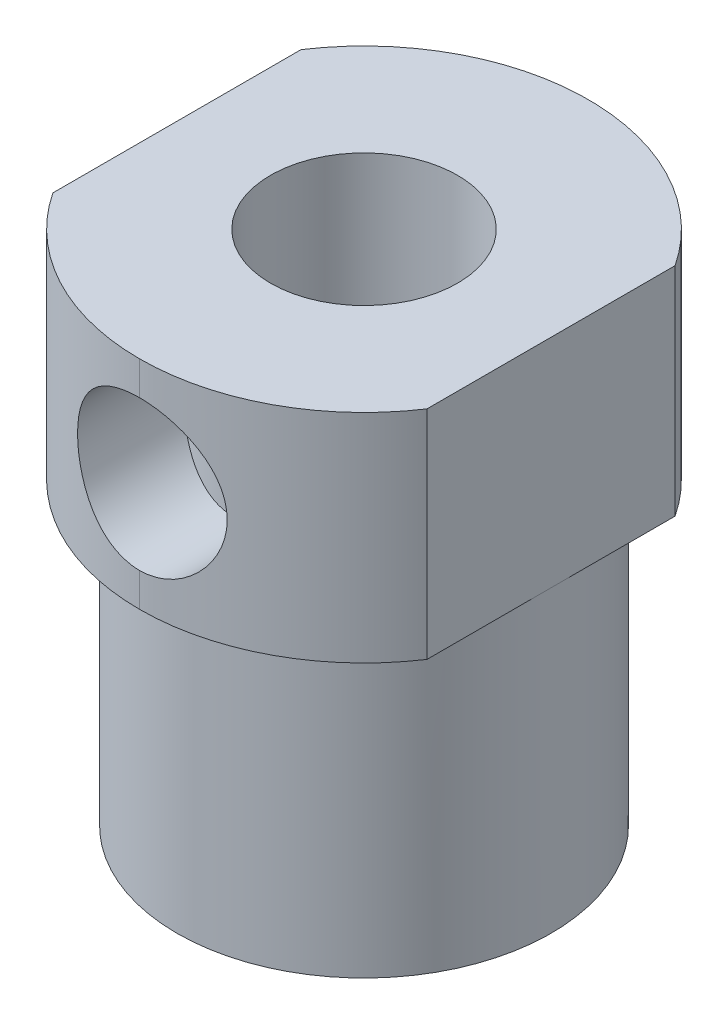
ISO-10303-21;
HEADER;
FILE_DESCRIPTION(('STEP AP214'),'2;1');
FILE_NAME('part.step','',(''),(''),'','','');
FILE_SCHEMA(('AUTOMOTIVE_DESIGN { 1 0 10303 214 1 1 1 1 }'));
ENDSEC;
DATA;
#1=APPLICATION_CONTEXT('core data for automotive mechanical design processes');
#2=APPLICATION_PROTOCOL_DEFINITION('international standard','automotive_design',2000,#1);
#3=PRODUCT_CONTEXT('',#1,'mechanical');
#4=PRODUCT('Part','Part','',(#3));
#5=PRODUCT_RELATED_PRODUCT_CATEGORY('part','',(#4));
#6=PRODUCT_DEFINITION_FORMATION('','',#4);
#7=PRODUCT_DEFINITION_CONTEXT('part definition',#1,'design');
#8=PRODUCT_DEFINITION('design','',#6,#7);
#9=PRODUCT_DEFINITION_SHAPE('','',#8);
#10=(LENGTH_UNIT() NAMED_UNIT(*) SI_UNIT(.MILLI.,.METRE.));
#11=(NAMED_UNIT(*) PLANE_ANGLE_UNIT() SI_UNIT($,.RADIAN.));
#12=(NAMED_UNIT(*) SI_UNIT($,.STERADIAN.) SOLID_ANGLE_UNIT());
#13=UNCERTAINTY_MEASURE_WITH_UNIT(LENGTH_MEASURE(1.E-05),#10,'distance_accuracy_value','');
#14=(GEOMETRIC_REPRESENTATION_CONTEXT(3) GLOBAL_UNCERTAINTY_ASSIGNED_CONTEXT((#13)) GLOBAL_UNIT_ASSIGNED_CONTEXT((#10,
#11,#12)) REPRESENTATION_CONTEXT('',''));
#15=CARTESIAN_POINT('',(0.,0.,0.));
#16=DIRECTION('',(0.,0.,1.));
#17=DIRECTION('',(1.,0.,0.));
#18=AXIS2_PLACEMENT_3D('',#15,#16,#17);
#19=CARTESIAN_POINT('',(0.,8.,6.));
#20=DIRECTION('',(0.,-1.,0.));
#21=DIRECTION('',(0.,0.,-1.));
#22=AXIS2_PLACEMENT_3D('',#19,#20,#21);
#23=PLANE('',#22);
#24=DIRECTION('',(0.,0.,-1.));
#25=VECTOR('',#24,1.);
#26=CARTESIAN_POINT('',(-5.,8.,-6.));
#27=LINE('',#26,#25);
#28=CARTESIAN_POINT('',(-5.,8.,0.));
#29=VERTEX_POINT('',#28);
#30=CARTESIAN_POINT('',(-5.,8.,-3.3166247903554));
#31=VERTEX_POINT('',#30);
#32=EDGE_CURVE('E135',#29,#31,#27,.T.);
#33=ORIENTED_EDGE('',*,*,#32,.T.);
#34=CARTESIAN_POINT('',(0.,8.,0.));
#35=DIRECTION('',(0.,1.,0.));
#36=DIRECTION('',(0.,0.,1.));
#37=AXIS2_PLACEMENT_3D('',#34,#35,#36);
#38=CIRCLE('',#37,6.);
#39=CARTESIAN_POINT('',(5.,8.,-3.3166247903554));
#40=VERTEX_POINT('',#39);
#41=EDGE_CURVE('E142',#40,#31,#38,.T.);
#42=ORIENTED_EDGE('',*,*,#41,.F.);
#43=DIRECTION('',(0.,0.,1.));
#44=VECTOR('',#43,1.);
#45=CARTESIAN_POINT('',(5.,8.,-6.));
#46=LINE('',#45,#44);
#47=CARTESIAN_POINT('',(5.,8.,0.));
#48=VERTEX_POINT('',#47);
#49=EDGE_CURVE('E127',#40,#48,#46,.T.);
#50=ORIENTED_EDGE('',*,*,#49,.T.);
#51=CARTESIAN_POINT('',(0.,8.,0.));
#52=DIRECTION('',(0.,1.,0.));
#53=DIRECTION('',(0.,0.,1.));
#54=AXIS2_PLACEMENT_3D('',#51,#52,#53);
#55=CIRCLE('',#54,5.);
#56=EDGE_CURVE('E167',#48,#29,#55,.T.);
#57=ORIENTED_EDGE('',*,*,#56,.T.);
#58=EDGE_LOOP('',(#33,#42,#50,#57));
#59=FACE_BOUND('',#58,.T.);
#60=ADVANCED_FACE('F47',(#59),#23,.T.);
#61=CARTESIAN_POINT('',(5.,8.,3.3166247903554));
#62=VERTEX_POINT('',#61);
#63=EDGE_CURVE('E130',#48,#62,#46,.T.);
#64=ORIENTED_EDGE('',*,*,#63,.T.);
#65=CARTESIAN_POINT('',(0.,8.,6.));
#66=VERTEX_POINT('',#65);
#67=EDGE_CURVE('E149',#66,#62,#38,.T.);
#68=ORIENTED_EDGE('',*,*,#67,.F.);
#69=DIRECTION('',(0.,0.,-1.));
#70=VECTOR('',#69,1.);
#71=CARTESIAN_POINT('',(0.,8.,6.));
#72=LINE('',#71,#70);
#73=CARTESIAN_POINT('',(0.,8.,5.));
#74=VERTEX_POINT('',#73);
#75=EDGE_CURVE('E159',#66,#74,#72,.T.);
#76=ORIENTED_EDGE('',*,*,#75,.T.);
#77=EDGE_CURVE('E163',#74,#48,#55,.T.);
#78=ORIENTED_EDGE('',*,*,#77,.T.);
#79=EDGE_LOOP('',(#64,#68,#76,#78));
#80=FACE_BOUND('',#79,.T.);
#81=ADVANCED_FACE('F283',(#80),#23,.T.);
#82=CARTESIAN_POINT('',(0.,0.,0.));
#83=DIRECTION('',(0.,1.,0.));
#84=DIRECTION('',(0.,0.,1.));
#85=AXIS2_PLACEMENT_3D('',#82,#83,#84);
#86=CYLINDRICAL_SURFACE('',#85,6.);
#87=DIRECTION('',(0.,1.,0.));
#88=VECTOR('',#87,1.);
#89=CARTESIAN_POINT('',(-5.,0.,-3.3166247903554));
#90=LINE('',#89,#88);
#91=CARTESIAN_POINT('',(-5.,13.8,-3.3166247903554));
#92=VERTEX_POINT('',#91);
#93=EDGE_CURVE('E201',#92,#31,#90,.F.);
#94=ORIENTED_EDGE('',*,*,#93,.F.);
#95=CARTESIAN_POINT('',(0.,13.8,0.));
#96=DIRECTION('',(0.,1.,0.));
#97=DIRECTION('',(0.,0.,1.));
#98=AXIS2_PLACEMENT_3D('',#95,#96,#97);
#99=CIRCLE('',#98,6.);
#100=CARTESIAN_POINT('',(5.,13.8,-3.3166247903554));
#101=VERTEX_POINT('',#100);
#102=EDGE_CURVE('E144',#101,#92,#99,.T.);
#103=ORIENTED_EDGE('',*,*,#102,.F.);
#104=DIRECTION('',(0.,1.,0.));
#105=VECTOR('',#104,1.);
#106=CARTESIAN_POINT('',(5.,0.,-3.3166247903554));
#107=LINE('',#106,#105);
#108=EDGE_CURVE('E69',#40,#101,#107,.T.);
#109=ORIENTED_EDGE('',*,*,#108,.F.);
#110=ORIENTED_EDGE('',*,*,#41,.T.);
#111=EDGE_LOOP('',(#94,#103,#109,#110));
#112=FACE_BOUND('',#111,.T.);
#113=ADVANCED_FACE('F141',(#112),#86,.T.);
#114=DIRECTION('',(0.,1.,0.));
#115=VECTOR('',#114,1.);
#116=CARTESIAN_POINT('',(5.,0.,3.3166247903554));
#117=LINE('',#116,#115);
#118=CARTESIAN_POINT('',(5.,13.8,3.3166247903554));
#119=VERTEX_POINT('',#118);
#120=EDGE_CURVE('E145',#119,#62,#117,.F.);
#121=ORIENTED_EDGE('',*,*,#120,.F.);
#122=CARTESIAN_POINT('',(0.,13.8,6.));
#123=VERTEX_POINT('',#122);
#124=EDGE_CURVE('E154',#123,#119,#99,.T.);
#125=ORIENTED_EDGE('',*,*,#124,.F.);
#126=DIRECTION('',(0.,-1.,0.));
#127=VECTOR('',#126,1.);
#128=CARTESIAN_POINT('',(0.,13.8,6.));
#129=LINE('',#128,#127);
#130=CARTESIAN_POINT('',(0.,12.9,6.));
#131=VERTEX_POINT('',#130);
#132=EDGE_CURVE('E157',#123,#131,#129,.T.);
#133=ORIENTED_EDGE('',*,*,#132,.T.);
#134=CARTESIAN_POINT('',(0.,8.9,6.));
#135=CARTESIAN_POINT('',(0.109126725773447,8.89999949253672,6.00000030601888));
#136=CARTESIAN_POINT('',(0.2182503890771,8.90896053225443,5.9969953901509));
#137=CARTESIAN_POINT('',(0.433283521745944,8.94445821763444,5.98530420406562));
#138=CARTESIAN_POINT('',(0.539192656237635,8.97099668789784,5.97661734404305));
#139=CARTESIAN_POINT('',(0.744665579003552,9.0406384867681,5.95450615812885));
#140=CARTESIAN_POINT('',(0.844239651772068,9.08371412491854,5.94108975461707));
#141=CARTESIAN_POINT('',(1.03474987361065,9.18508234567669,5.91088891434684));
#142=CARTESIAN_POINT('',(1.12568431391741,9.2433779300052,5.89410381335556));
#143=CARTESIAN_POINT('',(1.29948335004453,9.37565160971751,5.8582818888601));
#144=CARTESIAN_POINT('',(1.38200740059662,9.45006246852099,5.8391911292757));
#145=CARTESIAN_POINT('',(1.53366538540417,9.61153430941313,5.80120629566243));
#146=CARTESIAN_POINT('',(1.60279637097892,9.69859806985702,5.78231226581098));
#147=CARTESIAN_POINT('',(1.72764988445572,9.88597023039292,5.74626664954548));
#148=CARTESIAN_POINT('',(1.78292971644206,9.98658747946424,5.72918078551376));
#149=CARTESIAN_POINT('',(1.87563774775544,10.1963521889171,5.69950610837202));
#150=CARTESIAN_POINT('',(1.91307139477353,10.3054970343255,5.68691592321491));
#151=CARTESIAN_POINT('',(1.96774692301833,10.5253464429934,5.66822606538755));
#152=CARTESIAN_POINT('',(1.98562689654354,10.6358744169781,5.66192191539223));
#153=CARTESIAN_POINT('',(2.00268224666895,10.8585275083118,5.65591313259015));
#154=CARTESIAN_POINT('',(2.00186340320944,10.9706521214184,5.6562064604546));
#155=CARTESIAN_POINT('',(1.98203980740684,11.187873260888,5.66318030016361));
#156=CARTESIAN_POINT('',(1.96386782633399,11.293056805838,5.66956831735066));
#157=CARTESIAN_POINT('',(1.91121232569883,11.4987868392137,5.68753315449102));
#158=CARTESIAN_POINT('',(1.87672685318374,11.5993327708701,5.69911059568215));
#159=CARTESIAN_POINT('',(1.79187811612042,11.794825499183,5.72635822262498));
#160=CARTESIAN_POINT('',(1.74126809741453,11.8896560509391,5.74209131586235));
#161=CARTESIAN_POINT('',(1.62577821260628,12.0697418165595,5.77585117151453));
#162=CARTESIAN_POINT('',(1.56089422472801,12.1549942538668,5.79387859580927));
#163=CARTESIAN_POINT('',(1.41469866536448,12.3181831963215,5.83134658335482));
#164=CARTESIAN_POINT('',(1.33270630015262,12.3955053890181,5.85081178709686));
#165=CARTESIAN_POINT('',(1.15667913994013,12.5354625333268,5.88813876774074));
#166=CARTESIAN_POINT('',(1.06264319132163,12.598096076329,5.90600039076135));
#167=CARTESIAN_POINT('',(0.863895226092535,12.7073926004701,5.93834215875587));
#168=CARTESIAN_POINT('',(0.759086552832673,12.7538909826815,5.95278700016079));
#169=CARTESIAN_POINT('',(0.542538166729015,12.8284063479114,5.9764113428887));
#170=CARTESIAN_POINT('',(0.430800876309908,12.8564297508469,5.98559267309759));
#171=CARTESIAN_POINT('',(0.208767659058608,12.8921113320447,5.99735254142881));
#172=CARTESIAN_POINT('',(0.0986191997296927,12.9005996183455,6.00020003667456));
#173=CARTESIAN_POINT('',(-0.121550139920475,12.8993346528031,5.99977805389655));
#174=CARTESIAN_POINT('',(-0.231571038639301,12.8895844800402,5.99650960838725));
#175=CARTESIAN_POINT('',(-0.445039732608511,12.8527761845281,5.98440049434209));
#176=CARTESIAN_POINT('',(-0.548585613669687,12.826227587901,5.97572397422385));
#177=CARTESIAN_POINT('',(-0.749711917159147,12.7572131110665,5.9538369366014));
#178=CARTESIAN_POINT('',(-0.847291577017213,12.7147452010644,5.9406258409335));
#179=CARTESIAN_POINT('',(-1.03657659278655,12.6138591363184,5.9105786257458));
#180=CARTESIAN_POINT('',(-1.12805991843429,12.5550508134337,5.89365629511572));
#181=CARTESIAN_POINT('',(-1.30012966027117,12.423611699973,5.85810507832525));
#182=CARTESIAN_POINT('',(-1.38071273559115,12.3509766879365,5.83947567187655));
#183=CARTESIAN_POINT('',(-1.5325050156126,12.1900424979868,5.8015369596089));
#184=CARTESIAN_POINT('',(-1.60312193849154,12.1011815461463,5.78223522174856));
#185=CARTESIAN_POINT('',(-1.72851504464715,11.9124568643782,5.74599946589418));
#186=CARTESIAN_POINT('',(-1.78329109586203,11.8125930427318,5.72906546764005));
#187=CARTESIAN_POINT('',(-1.87519386083272,11.6046539694202,5.69964783582767));
#188=CARTESIAN_POINT('',(-1.91235626433004,11.4965958416625,5.68715521585958));
#189=CARTESIAN_POINT('',(-1.96778933351871,11.2752426999117,5.66821664612899));
#190=CARTESIAN_POINT('',(-1.98606850990788,11.1619500691913,5.66176797247279));
#191=CARTESIAN_POINT('',(-2.00255256495468,10.9396058079182,5.65595717748355));
#192=CARTESIAN_POINT('',(-2.0017405146168,10.8306353194264,5.6562480051483));
#193=CARTESIAN_POINT('',(-1.98248458689739,10.6144698501559,5.66302539647735));
#194=CARTESIAN_POINT('',(-1.96404175891717,10.5072747640898,5.66951159138723));
#195=CARTESIAN_POINT('',(-1.91074362625869,10.2997286739951,5.68769048609783));
#196=CARTESIAN_POINT('',(-1.87620669203103,10.199286349991,5.69928196044955));
#197=CARTESIAN_POINT('',(-1.79195873151949,10.0055451861235,5.72632797636937));
#198=CARTESIAN_POINT('',(-1.74224433710761,9.91224793762398,5.74178337526786));
#199=CARTESIAN_POINT('',(-1.62652138516686,9.73103266015418,5.77565658452093));
#200=CARTESIAN_POINT('',(-1.55989648552916,9.64352699620323,5.79417423284274));
#201=CARTESIAN_POINT('',(-1.4132857662713,9.4806203732316,5.83166712566506));
#202=CARTESIAN_POINT('',(-1.33329616890296,9.40522284862385,5.85064249824745));
#203=CARTESIAN_POINT('',(-1.15848311384138,9.26571117542164,5.88780061051088));
#204=CARTESIAN_POINT('',(-1.06320302699946,9.202151304498,5.90592363602513));
#205=CARTESIAN_POINT('',(-0.862714714813249,9.09201914229871,5.93851982345224));
#206=CARTESIAN_POINT('',(-0.757509036264697,9.04544250815592,5.9529939181586));
#207=CARTESIAN_POINT('',(-0.544987294401952,8.97255673502266,5.97611030137084));
#208=CARTESIAN_POINT('',(-0.437975515352818,8.94543506747325,5.98498424845045));
#209=CARTESIAN_POINT('',(-0.220640832020494,8.90915943864575,5.99692814128444));
#210=CARTESIAN_POINT('',(-0.110318851137493,8.90000051300693,5.9999996906381));
#211=CARTESIAN_POINT('',(0.,8.9,6.));
#212=B_SPLINE_CURVE_WITH_KNOTS('',3,(#134,#135,#136,#137,#138,#139,#140,#141,#142,#143,#144,
#145,#146,#147,#148,#149,#150,#151,#152,#153,#154,#155,#156,#157,#158,#159,#160,#161,#162,#163,
#164,#165,#166,#167,#168,#169,#170,#171,#172,#173,#174,#175,#176,#177,#178,#179,#180,#181,#182,
#183,#184,#185,#186,#187,#188,#189,#190,#191,#192,#193,#194,#195,#196,#197,#198,#199,#200,#201,
#202,#203,#204,#205,#206,#207,#208,#209,#210,#211),.UNSPECIFIED.,.T.,.F.,(4,2,2,2,2,2,2,2,2,2,2,
2,2,2,2,2,2,2,2,2,2,2,2,2,2,2,2,2,2,2,2,2,2,2,2,2,2,2,4),(0.,0.326974212052022,
0.653982370535041,0.980445345740547,1.3069727555982,1.64369368565512,1.9804886657506,
2.32696769646941,2.67334089385667,3.0080385148368,3.34263267974971,3.6619365310256,
3.98127861710964,4.30576342310261,4.63034205116414,4.97186611622734,5.31342291933237,
5.65836811300715,6.00319337754416,6.33307166350339,6.66289426328353,6.98316315956427,
7.30347290568208,7.63220799687473,7.96104361643782,8.30482045761504,8.64860016469993,
8.99168027653541,9.3346056941168,9.65991332128517,9.98520158702751,10.3043117416084,
10.6234927635196,10.9566013338361,11.2898042224756,11.635993216702,11.9820936230491,
12.3127311674763,12.6432773207628),.UNSPECIFIED.);
#213=CARTESIAN_POINT('',(0.,8.9,6.));
#214=VERTEX_POINT('',#213);
#215=EDGE_CURVE('E176',#214,#131,#212,.T.);
#216=ORIENTED_EDGE('',*,*,#215,.F.);
#217=EDGE_CURVE('E236',#214,#66,#129,.T.);
#218=ORIENTED_EDGE('',*,*,#217,.T.);
#219=ORIENTED_EDGE('',*,*,#67,.T.);
#220=EDGE_LOOP('',(#121,#125,#133,#216,#218,#219));
#221=FACE_BOUND('',#220,.T.);
#222=ADVANCED_FACE('F249',(#221),#86,.T.);
#223=CARTESIAN_POINT('',(0.,0.,0.));
#224=DIRECTION('',(0.,1.,0.));
#225=DIRECTION('',(0.,0.,1.));
#226=AXIS2_PLACEMENT_3D('',#223,#224,#225);
#227=CYLINDRICAL_SURFACE('',#226,5.);
#228=DIRECTION('',(0.,-1.,0.));
#229=VECTOR('',#228,1.);
#230=CARTESIAN_POINT('',(0.,8.,5.));
#231=LINE('',#230,#229);
#232=CARTESIAN_POINT('',(0.,0.,5.));
#233=VERTEX_POINT('',#232);
#234=EDGE_CURVE('E162',#74,#233,#231,.T.);
#235=ORIENTED_EDGE('',*,*,#234,.F.);
#236=EDGE_CURVE('E153',#29,#74,#55,.T.);
#237=ORIENTED_EDGE('',*,*,#236,.F.);
#238=ORIENTED_EDGE('',*,*,#56,.F.);
#239=ORIENTED_EDGE('',*,*,#77,.F.);
#240=ORIENTED_EDGE('',*,*,#234,.T.);
#241=CARTESIAN_POINT('',(0.,0.,0.));
#242=DIRECTION('',(0.,1.,0.));
#243=DIRECTION('',(0.,0.,1.));
#244=AXIS2_PLACEMENT_3D('',#241,#242,#243);
#245=CIRCLE('',#244,5.);
#246=EDGE_CURVE('E170',#233,#233,#245,.T.);
#247=ORIENTED_EDGE('',*,*,#246,.T.);
#248=EDGE_LOOP('',(#235,#237,#238,#239,#240,#247));
#249=FACE_BOUND('',#248,.T.);
#250=ADVANCED_FACE('F49',(#249),#227,.T.);
#251=CARTESIAN_POINT('',(-5.,8.,3.3166247903554));
#252=VERTEX_POINT('',#251);
#253=EDGE_CURVE('E146',#252,#29,#27,.T.);
#254=ORIENTED_EDGE('',*,*,#253,.T.);
#255=ORIENTED_EDGE('',*,*,#236,.T.);
#256=ORIENTED_EDGE('',*,*,#75,.F.);
#257=EDGE_CURVE('E150',#252,#66,#38,.T.);
#258=ORIENTED_EDGE('',*,*,#257,.F.);
#259=EDGE_LOOP('',(#254,#255,#256,#258));
#260=FACE_BOUND('',#259,.T.);
#261=ADVANCED_FACE('F287',(#260),#23,.T.);
#262=DIRECTION('',(0.,1.,0.));
#263=VECTOR('',#262,1.);
#264=CARTESIAN_POINT('',(-5.,0.,3.3166247903554));
#265=LINE('',#264,#263);
#266=CARTESIAN_POINT('',(-5.,13.8,3.3166247903554));
#267=VERTEX_POINT('',#266);
#268=EDGE_CURVE('E61',#252,#267,#265,.T.);
#269=ORIENTED_EDGE('',*,*,#268,.F.);
#270=ORIENTED_EDGE('',*,*,#257,.T.);
#271=ORIENTED_EDGE('',*,*,#217,.F.);
#272=EDGE_CURVE('E166',#131,#214,#212,.T.);
#273=ORIENTED_EDGE('',*,*,#272,.F.);
#274=ORIENTED_EDGE('',*,*,#132,.F.);
#275=EDGE_CURVE('E234',#267,#123,#99,.T.);
#276=ORIENTED_EDGE('',*,*,#275,.F.);
#277=EDGE_LOOP('',(#269,#270,#271,#273,#274,#276));
#278=FACE_BOUND('',#277,.T.);
#279=ADVANCED_FACE('F177',(#278),#86,.T.);
#280=CARTESIAN_POINT('',(0.,13.8,2.5));
#281=DIRECTION('',(0.,1.,0.));
#282=DIRECTION('',(0.,0.,1.));
#283=AXIS2_PLACEMENT_3D('',#280,#281,#282);
#284=PLANE('',#283);
#285=ORIENTED_EDGE('',*,*,#124,.T.);
#286=DIRECTION('',(0.,0.,1.));
#287=VECTOR('',#286,1.);
#288=CARTESIAN_POINT('',(5.,13.8,2.5));
#289=LINE('',#288,#287);
#290=EDGE_CURVE('E55',#101,#119,#289,.T.);
#291=ORIENTED_EDGE('',*,*,#290,.F.);
#292=ORIENTED_EDGE('',*,*,#102,.T.);
#293=DIRECTION('',(0.,0.,-1.));
#294=VECTOR('',#293,1.);
#295=CARTESIAN_POINT('',(-5.,13.8,2.5));
#296=LINE('',#295,#294);
#297=EDGE_CURVE('E12',#267,#92,#296,.T.);
#298=ORIENTED_EDGE('',*,*,#297,.F.);
#299=ORIENTED_EDGE('',*,*,#275,.T.);
#300=EDGE_LOOP('',(#285,#291,#292,#298,#299));
#301=FACE_BOUND('',#300,.T.);
#302=CARTESIAN_POINT('',(0.,13.8,0.));
#303=DIRECTION('',(0.,1.,0.));
#304=DIRECTION('',(0.,0.,1.));
#305=AXIS2_PLACEMENT_3D('',#302,#303,#304);
#306=CIRCLE('',#305,2.5);
#307=CARTESIAN_POINT('',(0.,13.8,2.5));
#308=VERTEX_POINT('',#307);
#309=EDGE_CURVE('E229',#308,#308,#306,.T.);
#310=ORIENTED_EDGE('',*,*,#309,.F.);
#311=EDGE_LOOP('',(#310));
#312=FACE_BOUND('',#311,.T.);
#313=ADVANCED_FACE('F242',(#301,#312),#284,.T.);
#314=CARTESIAN_POINT('',(0.,0.,0.));
#315=DIRECTION('',(0.,1.,0.));
#316=DIRECTION('',(0.,0.,1.));
#317=AXIS2_PLACEMENT_3D('',#314,#315,#316);
#318=CYLINDRICAL_SURFACE('',#317,2.5);
#319=DIRECTION('',(0.,1.,0.));
#320=VECTOR('',#319,1.);
#321=CARTESIAN_POINT('',(0.,5.,2.5));
#322=LINE('',#321,#320);
#323=CARTESIAN_POINT('',(0.,5.,2.5));
#324=VERTEX_POINT('',#323);
#325=EDGE_CURVE('E227',#324,#308,#322,.T.);
#326=ORIENTED_EDGE('',*,*,#325,.F.);
#327=CARTESIAN_POINT('',(0.,5.,0.));
#328=DIRECTION('',(0.,1.,0.));
#329=DIRECTION('',(0.,0.,1.));
#330=AXIS2_PLACEMENT_3D('',#327,#328,#329);
#331=CIRCLE('',#330,2.5);
#332=EDGE_CURVE('E224',#324,#324,#331,.T.);
#333=ORIENTED_EDGE('',*,*,#332,.F.);
#334=ORIENTED_EDGE('',*,*,#325,.T.);
#335=ORIENTED_EDGE('',*,*,#309,.T.);
#336=EDGE_LOOP('',(#326,#333,#334,#335));
#337=FACE_BOUND('',#336,.T.);
#338=ADVANCED_FACE('F255',(#337),#318,.F.);
#339=CARTESIAN_POINT('',(0.,5.,0.75));
#340=DIRECTION('',(0.,1.,0.));
#341=DIRECTION('',(0.,0.,1.));
#342=AXIS2_PLACEMENT_3D('',#339,#340,#341);
#343=PLANE('',#342);
#344=ORIENTED_EDGE('',*,*,#332,.T.);
#345=EDGE_LOOP('',(#344));
#346=FACE_BOUND('',#345,.T.);
#347=CARTESIAN_POINT('',(0.,5.,0.));
#348=DIRECTION('',(0.,1.,0.));
#349=DIRECTION('',(0.,0.,1.));
#350=AXIS2_PLACEMENT_3D('',#347,#348,#349);
#351=CIRCLE('',#350,0.75);
#352=CARTESIAN_POINT('',(0.,5.,0.75));
#353=VERTEX_POINT('',#352);
#354=EDGE_CURVE('E219',#353,#353,#351,.T.);
#355=ORIENTED_EDGE('',*,*,#354,.F.);
#356=EDGE_LOOP('',(#355));
#357=FACE_BOUND('',#356,.T.);
#358=ADVANCED_FACE('F259',(#346,#357),#343,.T.);
#359=CARTESIAN_POINT('',(0.,0.,0.));
#360=DIRECTION('',(0.,1.,0.));
#361=DIRECTION('',(0.,0.,1.));
#362=AXIS2_PLACEMENT_3D('',#359,#360,#361);
#363=CYLINDRICAL_SURFACE('',#362,0.75);
#364=DIRECTION('',(0.,1.,0.));
#365=VECTOR('',#364,1.);
#366=CARTESIAN_POINT('',(0.,3.,0.75));
#367=LINE('',#366,#365);
#368=CARTESIAN_POINT('',(0.,3.,0.75));
#369=VERTEX_POINT('',#368);
#370=EDGE_CURVE('E217',#369,#353,#367,.T.);
#371=ORIENTED_EDGE('',*,*,#370,.F.);
#372=CARTESIAN_POINT('',(0.,3.,0.));
#373=DIRECTION('',(0.,1.,0.));
#374=DIRECTION('',(0.,0.,1.));
#375=AXIS2_PLACEMENT_3D('',#372,#373,#374);
#376=CIRCLE('',#375,0.75);
#377=EDGE_CURVE('E214',#369,#369,#376,.T.);
#378=ORIENTED_EDGE('',*,*,#377,.F.);
#379=ORIENTED_EDGE('',*,*,#370,.T.);
#380=ORIENTED_EDGE('',*,*,#354,.T.);
#381=EDGE_LOOP('',(#371,#378,#379,#380));
#382=FACE_BOUND('',#381,.T.);
#383=ADVANCED_FACE('F263',(#382),#363,.F.);
#384=CARTESIAN_POINT('',(0.,3.,2.4));
#385=DIRECTION('',(0.,-1.,0.));
#386=DIRECTION('',(0.,0.,-1.));
#387=AXIS2_PLACEMENT_3D('',#384,#385,#386);
#388=PLANE('',#387);
#389=ORIENTED_EDGE('',*,*,#377,.T.);
#390=EDGE_LOOP('',(#389));
#391=FACE_BOUND('',#390,.T.);
#392=CARTESIAN_POINT('',(0.,3.,0.));
#393=DIRECTION('',(0.,1.,0.));
#394=DIRECTION('',(0.,0.,1.));
#395=AXIS2_PLACEMENT_3D('',#392,#393,#394);
#396=CIRCLE('',#395,2.4);
#397=CARTESIAN_POINT('',(0.,3.,2.4));
#398=VERTEX_POINT('',#397);
#399=EDGE_CURVE('E208',#398,#398,#396,.T.);
#400=ORIENTED_EDGE('',*,*,#399,.F.);
#401=EDGE_LOOP('',(#400));
#402=FACE_BOUND('',#401,.T.);
#403=ADVANCED_FACE('F267',(#391,#402),#388,.T.);
#404=CARTESIAN_POINT('',(0.,0.,0.));
#405=DIRECTION('',(0.,1.,0.));
#406=DIRECTION('',(0.,0.,1.));
#407=AXIS2_PLACEMENT_3D('',#404,#405,#406);
#408=CYLINDRICAL_SURFACE('',#407,2.4);
#409=DIRECTION('',(0.,1.,0.));
#410=VECTOR('',#409,1.);
#411=CARTESIAN_POINT('',(0.,0.,2.4));
#412=LINE('',#411,#410);
#413=CARTESIAN_POINT('',(0.,0.,2.4));
#414=VERTEX_POINT('',#413);
#415=EDGE_CURVE('E205',#414,#398,#412,.T.);
#416=ORIENTED_EDGE('',*,*,#415,.F.);
#417=CARTESIAN_POINT('',(0.,0.,0.));
#418=DIRECTION('',(0.,1.,0.));
#419=DIRECTION('',(0.,0.,1.));
#420=AXIS2_PLACEMENT_3D('',#417,#418,#419);
#421=CIRCLE('',#420,2.4);
#422=EDGE_CURVE('E206',#414,#414,#421,.T.);
#423=ORIENTED_EDGE('',*,*,#422,.F.);
#424=ORIENTED_EDGE('',*,*,#415,.T.);
#425=ORIENTED_EDGE('',*,*,#399,.T.);
#426=EDGE_LOOP('',(#416,#423,#424,#425));
#427=FACE_BOUND('',#426,.T.);
#428=ADVANCED_FACE('F271',(#427),#408,.F.);
#429=CARTESIAN_POINT('',(0.,0.,5.));
#430=DIRECTION('',(0.,-1.,0.));
#431=DIRECTION('',(0.,0.,-1.));
#432=AXIS2_PLACEMENT_3D('',#429,#430,#431);
#433=PLANE('',#432);
#434=ORIENTED_EDGE('',*,*,#422,.T.);
#435=EDGE_LOOP('',(#434));
#436=FACE_BOUND('',#435,.T.);
#437=ORIENTED_EDGE('',*,*,#246,.F.);
#438=EDGE_LOOP('',(#437));
#439=FACE_BOUND('',#438,.T.);
#440=ADVANCED_FACE('F186',(#436,#439),#433,.T.);
#441=CARTESIAN_POINT('',(0.,10.9,-8.001));
#442=DIRECTION('',(0.,0.,1.));
#443=DIRECTION('',(1.,0.,0.));
#444=AXIS2_PLACEMENT_3D('',#441,#442,#443);
#445=CYLINDRICAL_SURFACE('',#444,2.);
#446=ORIENTED_EDGE('',*,*,#215,.T.);
#447=ORIENTED_EDGE('',*,*,#272,.T.);
#448=EDGE_LOOP('',(#446,#447));
#449=FACE_BOUND('',#448,.T.);
#450=CARTESIAN_POINT('',(2.,10.9,2.87228132326901));
#451=CARTESIAN_POINT('',(1.99999795577564,11.0017592830232,2.87228454712099));
#452=CARTESIAN_POINT('',(1.99218519270229,11.103533271682,2.87777067623112));
#453=CARTESIAN_POINT('',(1.96144931078719,11.3037345953644,2.89880046688832));
#454=CARTESIAN_POINT('',(1.938510080698,11.4021582442557,2.91435485184119));
#455=CARTESIAN_POINT('',(1.87896057653214,11.5923785007198,2.95309076236743));
#456=CARTESIAN_POINT('',(1.84243903117341,11.6842136030447,2.97622267211548));
#457=CARTESIAN_POINT('',(1.75704253677619,11.8604159991813,3.02742059167266));
#458=CARTESIAN_POINT('',(1.7081636279035,11.9447808874899,3.05548818220821));
#459=CARTESIAN_POINT('',(1.59317521338083,12.1138193412283,3.11712928824724));
#460=CARTESIAN_POINT('',(1.52576320711111,12.1975100653066,3.15096898375113));
#461=CARTESIAN_POINT('',(1.37830388138079,12.3531979078817,3.21820634481925));
#462=CARTESIAN_POINT('',(1.2982484020457,12.4251874133116,3.25160370971936));
#463=CARTESIAN_POINT('',(1.11854160271473,12.5621670849296,3.31796239643438));
#464=CARTESIAN_POINT('',(1.01775177832643,12.6258454282399,3.35058180751117));
#465=CARTESIAN_POINT('',(0.804671960588808,12.7348808699963,3.40802542898886));
#466=CARTESIAN_POINT('',(0.692391570313776,12.780253113253,3.43285607930473));
#467=CARTESIAN_POINT('',(0.470016279358691,12.8471381003936,3.46996336372305));
#468=CARTESIAN_POINT('',(0.360605805974551,12.8704056416371,3.48315582593062));
#469=CARTESIAN_POINT('',(0.138713712116241,12.8983070039505,3.49901289726841));
#470=CARTESIAN_POINT('',(0.026234717693813,12.9029562842789,3.50168624068257));
#471=CARTESIAN_POINT('',(-0.184946963787596,12.89391310016,3.49652510240883));
#472=CARTESIAN_POINT('',(-0.283772577167377,12.8822302435616,3.48984178265963));
#473=CARTESIAN_POINT('',(-0.477779282721359,12.8446054755532,3.4686091056649));
#474=CARTESIAN_POINT('',(-0.572960106226071,12.8186625151398,3.45405916973575));
#475=CARTESIAN_POINT('',(-0.758178496759091,12.7533490077033,3.41820908135194));
#476=CARTESIAN_POINT('',(-0.848162877368191,12.7138612525879,3.39685012587018));
#477=CARTESIAN_POINT('',(-1.02037827753867,12.6228821588301,3.34915268765434));
#478=CARTESIAN_POINT('',(-1.10260700085174,12.5713872807623,3.3228127370703));
#479=CARTESIAN_POINT('',(-1.26692918495856,12.4512540787214,3.26394555274582));
#480=CARTESIAN_POINT('',(-1.34795656029944,12.3813358417742,3.23105548059221));
#481=CARTESIAN_POINT('',(-1.49778980682765,12.2296653406589,3.16439037140551));
#482=CARTESIAN_POINT('',(-1.56658064643715,12.1478987423473,3.13061430362079));
#483=CARTESIAN_POINT('',(-1.69686219905414,11.9651197771164,3.06212243151114));
#484=CARTESIAN_POINT('',(-1.75694261459508,11.8630015584359,3.02764831081433));
#485=CARTESIAN_POINT('',(-1.85868169503534,11.6479224740869,2.96628701949477));
#486=CARTESIAN_POINT('',(-1.90037300071843,11.5349812567628,2.93938643675613));
#487=CARTESIAN_POINT('',(-1.955874001455,11.3280904093733,2.90265362950898));
#488=CARTESIAN_POINT('',(-1.97388069289566,11.2357086578265,2.89032428676995));
#489=CARTESIAN_POINT('',(-1.99669026146642,11.0486118291551,2.87461858134697));
#490=CARTESIAN_POINT('',(-2.00150579796718,10.9538990772199,2.87123363495883));
#491=CARTESIAN_POINT('',(-1.99766863089417,10.7648365678788,2.87390377719123));
#492=CARTESIAN_POINT('',(-1.98900796355997,10.6704870581669,2.87996444770089));
#493=CARTESIAN_POINT('',(-1.95870152807444,10.4848504035423,2.90065746980172));
#494=CARTESIAN_POINT('',(-1.93704629977864,10.3935655408914,2.91529606600907));
#495=CARTESIAN_POINT('',(-1.88140846842958,10.2150467183333,2.95150911798998));
#496=CARTESIAN_POINT('',(-1.84727488278457,10.1278778052751,2.97316813748298));
#497=CARTESIAN_POINT('',(-1.7678570298669,9.9601580411715,3.02106419530222));
#498=CARTESIAN_POINT('',(-1.7225682138661,9.87960990777189,3.04730309987681));
#499=CARTESIAN_POINT('',(-1.61341400894957,9.71325268153364,3.10666399761926));
#500=CARTESIAN_POINT('',(-1.54771199604101,9.62879528513002,3.14020508074668));
#501=CARTESIAN_POINT('',(-1.40365915117369,9.47131427874167,3.20718874482692));
#502=CARTESIAN_POINT('',(-1.32529785443659,9.39830022761586,3.2406312207748));
#503=CARTESIAN_POINT('',(-1.14867494696647,9.25852126094338,3.30761562311545));
#504=CARTESIAN_POINT('',(-1.04920745926284,9.19310873658224,3.34083391107345));
#505=CARTESIAN_POINT('',(-0.838502048903107,9.08034155276657,3.39983021540636));
#506=CARTESIAN_POINT('',(-0.727273517759582,9.03297262207423,3.42561410793537));
#507=CARTESIAN_POINT('',(-0.505697568225679,8.96178357529654,3.46494999115133));
#508=CARTESIAN_POINT('',(-0.396016146177117,8.93635978582013,3.47932715272067));
#509=CARTESIAN_POINT('',(-0.173110532524931,8.90433536680257,3.49749840717713));
#510=CARTESIAN_POINT('',(-0.0598895624756797,8.89771809717953,3.50130185566164));
#511=CARTESIAN_POINT('',(0.15266344638814,8.90333700696405,3.49809507365951));
#512=CARTESIAN_POINT('',(0.252078181064022,8.9134683723694,3.49229198229475));
#513=CARTESIAN_POINT('',(0.44751642437318,8.94818585964827,3.47266080925366));
#514=CARTESIAN_POINT('',(0.543539754940807,8.97277273931599,3.45883230686573));
#515=CARTESIAN_POINT('',(0.729940626918286,9.03536125908768,3.42435356756848));
#516=CARTESIAN_POINT('',(0.82030861169086,9.0733849211255,3.40369213555968));
#517=CARTESIAN_POINT('',(0.99349763491279,9.16149139168324,3.35723286822269));
#518=CARTESIAN_POINT('',(1.07631659934354,9.21157750055759,3.33143362749563));
#519=CARTESIAN_POINT('',(1.24182171167628,9.3286147237717,3.27358852163638));
#520=CARTESIAN_POINT('',(1.32349322177373,9.3968142827863,3.24116776373343));
#521=CARTESIAN_POINT('',(1.47489022304119,9.54503069512225,3.17514349361031));
#522=CARTESIAN_POINT('',(1.54460124934942,9.62506164253735,3.14153860767596));
#523=CARTESIAN_POINT('',(1.67746044898754,9.80461301601688,3.07282960146827));
#524=CARTESIAN_POINT('',(1.73915916121082,9.90529644484259,3.03793640760435));
#525=CARTESIAN_POINT('',(1.84444649268112,10.1176918280063,2.97519675497848));
#526=CARTESIAN_POINT('',(1.88806476770662,10.2293853478998,2.94733878651355));
#527=CARTESIAN_POINT('',(1.94723136203471,10.4342742390197,2.9084776323925));
#528=CARTESIAN_POINT('',(1.96692818344741,10.5258163403271,2.89507162454789));
#529=CARTESIAN_POINT('',(1.99330737566684,10.7115698083359,2.87697604487482));
#530=CARTESIAN_POINT('',(2.00000189279715,10.8057786003331,2.87227833822592));
#531=CARTESIAN_POINT('',(2.,10.9,2.87228132326901));
#532=B_SPLINE_CURVE_WITH_KNOTS('',3,(#450,#451,#452,#453,#454,#455,#456,#457,#458,#459,#460,
#461,#462,#463,#464,#465,#466,#467,#468,#469,#470,#471,#472,#473,#474,#475,#476,#477,#478,#479,
#480,#481,#482,#483,#484,#485,#486,#487,#488,#489,#490,#491,#492,#493,#494,#495,#496,#497,#498,
#499,#500,#501,#502,#503,#504,#505,#506,#507,#508,#509,#510,#511,#512,#513,#514,#515,#516,#517,
#518,#519,#520,#521,#522,#523,#524,#525,#526,#527,#528,#529,#530,#531),.UNSPECIFIED.,.T.,.F.,(4,
2,2,2,2,2,2,2,2,2,2,2,2,2,2,2,2,2,2,2,2,2,2,2,2,2,2,2,2,2,2,2,2,2,2,2,2,2,2,2,4),(0.,
0.304883874922046,0.610093008270221,0.913342368040704,1.21668902547472,1.55333694497106,
1.89020302568346,2.25902542597166,2.62754206720092,2.96347760859663,3.29913415548684,
3.59693222043896,3.89475219497793,4.1952171976663,4.49577088279065,4.83030033345032,
5.16523793001608,5.53354788734201,5.90120143518938,6.18472748221689,6.46798133769669,
6.75140264557764,7.03503053719285,7.32221037238044,7.60950750428142,7.944568532569,
8.27990796934229,8.64873850633052,9.01727671507228,9.35580044793154,9.69402456028397,
9.99288076018055,10.291752628263,10.591116615435,10.8905626035456,11.222913671625,
11.5556638903259,11.9232239861485,12.2901787962962,12.572742293729,12.8550417024667),.UNSPECIFIED.);
#533=CARTESIAN_POINT('',(2.,10.9,2.87228132326901));
#534=VERTEX_POINT('',#533);
#535=EDGE_CURVE('E193',#534,#534,#532,.T.);
#536=ORIENTED_EDGE('',*,*,#535,.F.);
#537=EDGE_LOOP('',(#536));
#538=FACE_BOUND('',#537,.T.);
#539=ADVANCED_FACE('F180',(#449,#538),#445,.F.);
#540=CARTESIAN_POINT('',(0.,0.,0.));
#541=DIRECTION('',(0.,1.,0.));
#542=DIRECTION('',(0.,0.,1.));
#543=AXIS2_PLACEMENT_3D('',#540,#541,#542);
#544=CYLINDRICAL_SURFACE('',#543,3.5);
#545=ORIENTED_EDGE('',*,*,#535,.T.);
#546=EDGE_LOOP('',(#545));
#547=FACE_BOUND('',#546,.T.);
#548=ADVANCED_FACE('F185',(#547),#544,.T.);
#549=CARTESIAN_POINT('',(5.,-4.0415945787923,-6.));
#550=DIRECTION('',(-1.,0.,0.));
#551=DIRECTION('',(0.,0.,1.));
#552=AXIS2_PLACEMENT_3D('',#549,#550,#551);
#553=PLANE('',#552);
#554=ORIENTED_EDGE('',*,*,#120,.T.);
#555=ORIENTED_EDGE('',*,*,#63,.F.);
#556=ORIENTED_EDGE('',*,*,#49,.F.);
#557=ORIENTED_EDGE('',*,*,#108,.T.);
#558=ORIENTED_EDGE('',*,*,#290,.T.);
#559=EDGE_LOOP('',(#554,#555,#556,#557,#558));
#560=FACE_BOUND('',#559,.T.);
#561=ADVANCED_FACE('F128',(#560),#553,.F.);
#562=CARTESIAN_POINT('',(-5.,-4.0415945787923,-6.));
#563=DIRECTION('',(1.,0.,0.));
#564=DIRECTION('',(0.,0.,-1.));
#565=AXIS2_PLACEMENT_3D('',#562,#563,#564);
#566=PLANE('',#565);
#567=ORIENTED_EDGE('',*,*,#93,.T.);
#568=ORIENTED_EDGE('',*,*,#32,.F.);
#569=ORIENTED_EDGE('',*,*,#253,.F.);
#570=ORIENTED_EDGE('',*,*,#268,.T.);
#571=ORIENTED_EDGE('',*,*,#297,.T.);
#572=EDGE_LOOP('',(#567,#568,#569,#570,#571));
#573=FACE_BOUND('',#572,.T.);
#574=ADVANCED_FACE('F290',(#573),#566,.F.);
#575=CLOSED_SHELL('',(#60,#81,#113,#222,#250,#261,#279,#313,#338,#358,#383,#403,#428,#440,#539,
#548,#561,#574));
#576=MANIFOLD_SOLID_BREP('B2',#575);
#577=ADVANCED_BREP_SHAPE_REPRESENTATION('',(#18,#576),#14);
#578=SHAPE_DEFINITION_REPRESENTATION(#9,#577);
ENDSEC;
END-ISO-10303-21;
